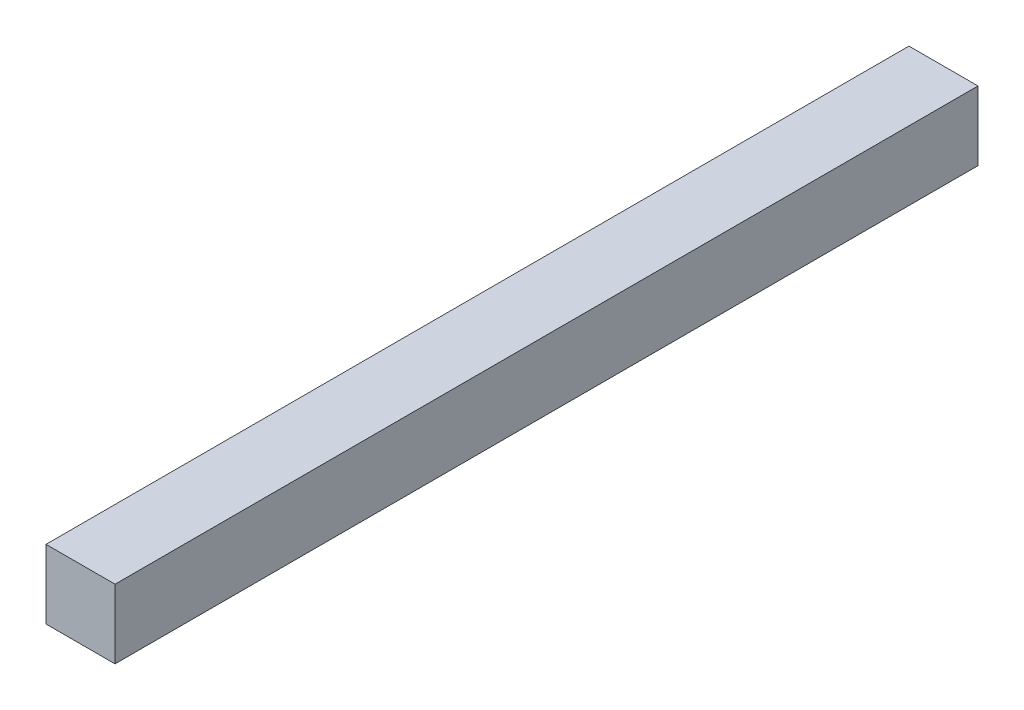
ISO-10303-21;
HEADER;
FILE_DESCRIPTION(('STEP AP214'),'2;1');
FILE_NAME('part.step','',(''),(''),'','','');
FILE_SCHEMA(('AUTOMOTIVE_DESIGN { 1 0 10303 214 1 1 1 1 }'));
ENDSEC;
DATA;
#1=APPLICATION_CONTEXT('core data for automotive mechanical design processes');
#2=APPLICATION_PROTOCOL_DEFINITION('international standard','automotive_design',2000,#1);
#3=PRODUCT_CONTEXT('',#1,'mechanical');
#4=PRODUCT('Part','Part','',(#3));
#5=PRODUCT_RELATED_PRODUCT_CATEGORY('part','',(#4));
#6=PRODUCT_DEFINITION_FORMATION('','',#4);
#7=PRODUCT_DEFINITION_CONTEXT('part definition',#1,'design');
#8=PRODUCT_DEFINITION('design','',#6,#7);
#9=PRODUCT_DEFINITION_SHAPE('','',#8);
#10=(LENGTH_UNIT() NAMED_UNIT(*) SI_UNIT(.MILLI.,.METRE.));
#11=(NAMED_UNIT(*) PLANE_ANGLE_UNIT() SI_UNIT($,.RADIAN.));
#12=(NAMED_UNIT(*) SI_UNIT($,.STERADIAN.) SOLID_ANGLE_UNIT());
#13=UNCERTAINTY_MEASURE_WITH_UNIT(LENGTH_MEASURE(1.E-05),#10,'distance_accuracy_value','');
#14=(GEOMETRIC_REPRESENTATION_CONTEXT(3) GLOBAL_UNCERTAINTY_ASSIGNED_CONTEXT((#13)) GLOBAL_UNIT_ASSIGNED_CONTEXT((#10,
#11,#12)) REPRESENTATION_CONTEXT('',''));
#15=CARTESIAN_POINT('',(0.,0.,0.));
#16=DIRECTION('',(0.,0.,1.));
#17=DIRECTION('',(1.,0.,0.));
#18=AXIS2_PLACEMENT_3D('',#15,#16,#17);
#19=CARTESIAN_POINT('',(0.,0.,1000.));
#20=DIRECTION('',(1.,0.,0.));
#21=DIRECTION('',(0.,0.,-1.));
#22=AXIS2_PLACEMENT_3D('',#19,#20,#21);
#23=PLANE('',#22);
#24=DIRECTION('',(0.,-1.,0.));
#25=VECTOR('',#24,1.);
#26=CARTESIAN_POINT('',(0.,0.,0.));
#27=LINE('',#26,#25);
#28=CARTESIAN_POINT('',(0.,80.,0.));
#29=VERTEX_POINT('',#28);
#30=CARTESIAN_POINT('',(0.,0.,0.));
#31=VERTEX_POINT('',#30);
#32=EDGE_CURVE('E111',#29,#31,#27,.T.);
#33=ORIENTED_EDGE('',*,*,#32,.T.);
#34=DIRECTION('',(0.,0.,-1.));
#35=VECTOR('',#34,1.);
#36=CARTESIAN_POINT('',(0.,0.,1000.));
#37=LINE('',#36,#35);
#38=CARTESIAN_POINT('',(0.,0.,1000.));
#39=VERTEX_POINT('',#38);
#40=EDGE_CURVE('E11',#39,#31,#37,.T.);
#41=ORIENTED_EDGE('',*,*,#40,.F.);
#42=DIRECTION('',(0.,-1.,0.));
#43=VECTOR('',#42,1.);
#44=CARTESIAN_POINT('',(0.,0.,1000.));
#45=LINE('',#44,#43);
#46=CARTESIAN_POINT('',(0.,80.,1000.));
#47=VERTEX_POINT('',#46);
#48=EDGE_CURVE('E95',#47,#39,#45,.T.);
#49=ORIENTED_EDGE('',*,*,#48,.F.);
#50=DIRECTION('',(0.,0.,-1.));
#51=VECTOR('',#50,1.);
#52=CARTESIAN_POINT('',(0.,80.,1000.));
#53=LINE('',#52,#51);
#54=EDGE_CURVE('E107',#47,#29,#53,.T.);
#55=ORIENTED_EDGE('',*,*,#54,.T.);
#56=EDGE_LOOP('',(#33,#41,#49,#55));
#57=FACE_BOUND('',#56,.T.);
#58=ADVANCED_FACE('F43',(#57),#23,.F.);
#59=CARTESIAN_POINT('',(0.,0.,1000.));
#60=DIRECTION('',(0.,1.,0.));
#61=DIRECTION('',(0.,0.,1.));
#62=AXIS2_PLACEMENT_3D('',#59,#60,#61);
#63=PLANE('',#62);
#64=DIRECTION('',(1.,0.,0.));
#65=VECTOR('',#64,1.);
#66=CARTESIAN_POINT('',(0.,0.,0.));
#67=LINE('',#66,#65);
#68=CARTESIAN_POINT('',(80.,0.,0.));
#69=VERTEX_POINT('',#68);
#70=EDGE_CURVE('E100',#31,#69,#67,.T.);
#71=ORIENTED_EDGE('',*,*,#70,.T.);
#72=DIRECTION('',(0.,0.,-1.));
#73=VECTOR('',#72,1.);
#74=CARTESIAN_POINT('',(80.,0.,1000.));
#75=LINE('',#74,#73);
#76=CARTESIAN_POINT('',(80.,0.,1000.));
#77=VERTEX_POINT('',#76);
#78=EDGE_CURVE('E52',#77,#69,#75,.T.);
#79=ORIENTED_EDGE('',*,*,#78,.F.);
#80=DIRECTION('',(1.,0.,0.));
#81=VECTOR('',#80,1.);
#82=CARTESIAN_POINT('',(0.,0.,1000.));
#83=LINE('',#82,#81);
#84=EDGE_CURVE('E90',#39,#77,#83,.T.);
#85=ORIENTED_EDGE('',*,*,#84,.F.);
#86=ORIENTED_EDGE('',*,*,#40,.T.);
#87=EDGE_LOOP('',(#71,#79,#85,#86));
#88=FACE_BOUND('',#87,.T.);
#89=ADVANCED_FACE('F99',(#88),#63,.F.);
#90=CARTESIAN_POINT('',(80.,0.,1000.));
#91=DIRECTION('',(-1.,0.,0.));
#92=DIRECTION('',(0.,0.,1.));
#93=AXIS2_PLACEMENT_3D('',#90,#91,#92);
#94=PLANE('',#93);
#95=DIRECTION('',(0.,1.,0.));
#96=VECTOR('',#95,1.);
#97=CARTESIAN_POINT('',(80.,0.,0.));
#98=LINE('',#97,#96);
#99=CARTESIAN_POINT('',(80.,80.,0.));
#100=VERTEX_POINT('',#99);
#101=EDGE_CURVE('E77',#69,#100,#98,.T.);
#102=ORIENTED_EDGE('',*,*,#101,.T.);
#103=DIRECTION('',(0.,0.,-1.));
#104=VECTOR('',#103,1.);
#105=CARTESIAN_POINT('',(80.,80.,1000.));
#106=LINE('',#105,#104);
#107=CARTESIAN_POINT('',(80.,80.,1000.));
#108=VERTEX_POINT('',#107);
#109=EDGE_CURVE('E102',#108,#100,#106,.T.);
#110=ORIENTED_EDGE('',*,*,#109,.F.);
#111=DIRECTION('',(0.,1.,0.));
#112=VECTOR('',#111,1.);
#113=CARTESIAN_POINT('',(80.,0.,1000.));
#114=LINE('',#113,#112);
#115=EDGE_CURVE('E93',#77,#108,#114,.T.);
#116=ORIENTED_EDGE('',*,*,#115,.F.);
#117=ORIENTED_EDGE('',*,*,#78,.T.);
#118=EDGE_LOOP('',(#102,#110,#116,#117));
#119=FACE_BOUND('',#118,.T.);
#120=ADVANCED_FACE('F103',(#119),#94,.F.);
#121=CARTESIAN_POINT('',(0.,80.,1000.));
#122=DIRECTION('',(0.,-1.,0.));
#123=DIRECTION('',(0.,0.,-1.));
#124=AXIS2_PLACEMENT_3D('',#121,#122,#123);
#125=PLANE('',#124);
#126=DIRECTION('',(-1.,0.,0.));
#127=VECTOR('',#126,1.);
#128=CARTESIAN_POINT('',(0.,80.,0.));
#129=LINE('',#128,#127);
#130=EDGE_CURVE('E83',#100,#29,#129,.T.);
#131=ORIENTED_EDGE('',*,*,#130,.T.);
#132=ORIENTED_EDGE('',*,*,#54,.F.);
#133=DIRECTION('',(-1.,0.,0.));
#134=VECTOR('',#133,1.);
#135=CARTESIAN_POINT('',(0.,80.,1000.));
#136=LINE('',#135,#134);
#137=EDGE_CURVE('E60',#108,#47,#136,.T.);
#138=ORIENTED_EDGE('',*,*,#137,.F.);
#139=ORIENTED_EDGE('',*,*,#109,.T.);
#140=EDGE_LOOP('',(#131,#132,#138,#139));
#141=FACE_BOUND('',#140,.T.);
#142=ADVANCED_FACE('F124',(#141),#125,.F.);
#143=CARTESIAN_POINT('',(0.,0.,1000.));
#144=DIRECTION('',(0.,0.,-1.));
#145=DIRECTION('',(-1.,0.,0.));
#146=AXIS2_PLACEMENT_3D('',#143,#144,#145);
#147=PLANE('',#146);
#148=ORIENTED_EDGE('',*,*,#48,.T.);
#149=ORIENTED_EDGE('',*,*,#84,.T.);
#150=ORIENTED_EDGE('',*,*,#115,.T.);
#151=ORIENTED_EDGE('',*,*,#137,.T.);
#152=EDGE_LOOP('',(#148,#149,#150,#151));
#153=FACE_BOUND('',#152,.T.);
#154=ADVANCED_FACE('F91',(#153),#147,.F.);
#155=CARTESIAN_POINT('',(0.,0.,0.));
#156=DIRECTION('',(0.,0.,-1.));
#157=DIRECTION('',(-1.,0.,0.));
#158=AXIS2_PLACEMENT_3D('',#155,#156,#157);
#159=PLANE('',#158);
#160=ORIENTED_EDGE('',*,*,#32,.F.);
#161=ORIENTED_EDGE('',*,*,#130,.F.);
#162=ORIENTED_EDGE('',*,*,#101,.F.);
#163=ORIENTED_EDGE('',*,*,#70,.F.);
#164=EDGE_LOOP('',(#160,#161,#162,#163));
#165=FACE_BOUND('',#164,.T.);
#166=ADVANCED_FACE('F127',(#165),#159,.T.);
#167=CLOSED_SHELL('',(#58,#89,#120,#142,#154,#166));
#168=MANIFOLD_SOLID_BREP('B2',#167);
#169=ADVANCED_BREP_SHAPE_REPRESENTATION('',(#18,#168),#14);
#170=SHAPE_DEFINITION_REPRESENTATION(#9,#169);
ENDSEC;
END-ISO-10303-21;
